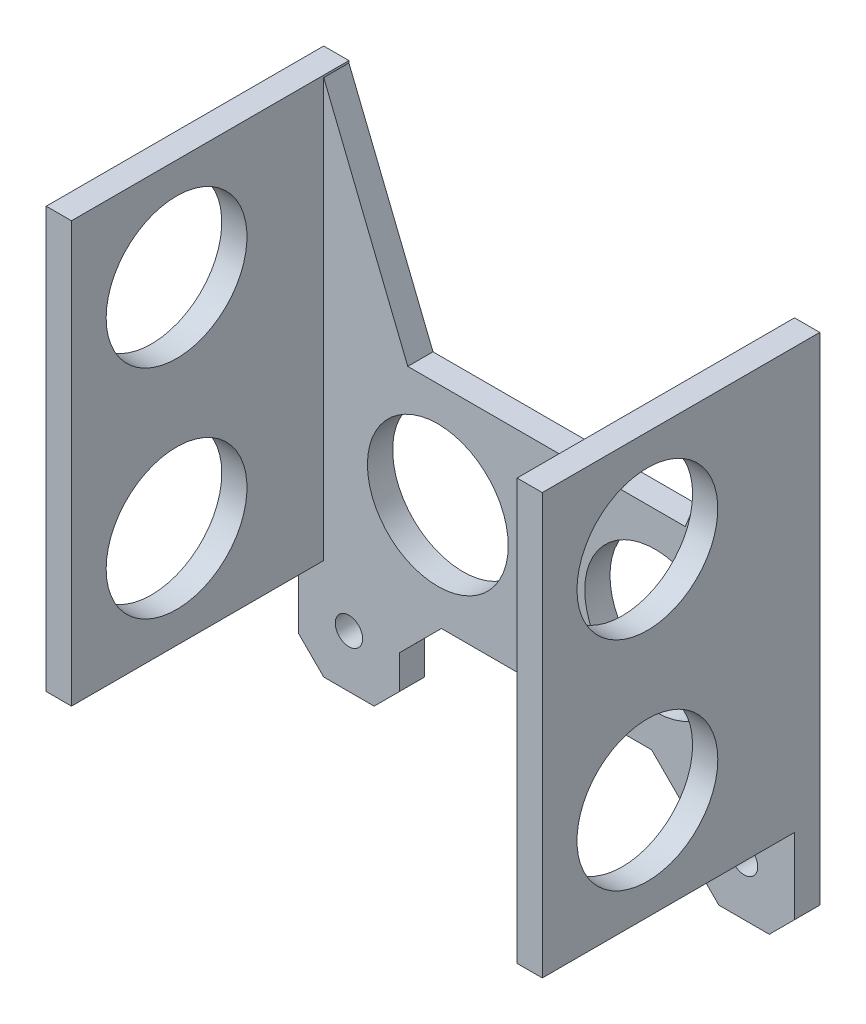
ISO-10303-21;
HEADER;
FILE_DESCRIPTION(('STEP AP214'),'2;1');
FILE_NAME('part.step','',(''),(''),'','','');
FILE_SCHEMA(('AUTOMOTIVE_DESIGN { 1 0 10303 214 1 1 1 1 }'));
ENDSEC;
DATA;
#1=APPLICATION_CONTEXT('core data for automotive mechanical design processes');
#2=APPLICATION_PROTOCOL_DEFINITION('international standard','automotive_design',2000,#1);
#3=PRODUCT_CONTEXT('',#1,'mechanical');
#4=PRODUCT('Part','Part','',(#3));
#5=PRODUCT_RELATED_PRODUCT_CATEGORY('part','',(#4));
#6=PRODUCT_DEFINITION_FORMATION('','',#4);
#7=PRODUCT_DEFINITION_CONTEXT('part definition',#1,'design');
#8=PRODUCT_DEFINITION('design','',#6,#7);
#9=PRODUCT_DEFINITION_SHAPE('','',#8);
#10=(LENGTH_UNIT() NAMED_UNIT(*) SI_UNIT(.MILLI.,.METRE.));
#11=(NAMED_UNIT(*) PLANE_ANGLE_UNIT() SI_UNIT($,.RADIAN.));
#12=(NAMED_UNIT(*) SI_UNIT($,.STERADIAN.) SOLID_ANGLE_UNIT());
#13=UNCERTAINTY_MEASURE_WITH_UNIT(LENGTH_MEASURE(1.E-05),#10,'distance_accuracy_value','');
#14=(GEOMETRIC_REPRESENTATION_CONTEXT(3) GLOBAL_UNCERTAINTY_ASSIGNED_CONTEXT((#13)) GLOBAL_UNIT_ASSIGNED_CONTEXT((#10,
#11,#12)) REPRESENTATION_CONTEXT('',''));
#15=CARTESIAN_POINT('',(0.,0.,0.));
#16=DIRECTION('',(0.,0.,1.));
#17=DIRECTION('',(1.,0.,0.));
#18=AXIS2_PLACEMENT_3D('',#15,#16,#17);
#19=CARTESIAN_POINT('',(0.,0.,0.));
#20=DIRECTION('',(0.,-1.,0.));
#21=DIRECTION('',(0.,0.,-1.));
#22=AXIS2_PLACEMENT_3D('',#19,#20,#21);
#23=PLANE('',#22);
#24=DIRECTION('',(0.,0.,1.));
#25=VECTOR('',#24,1.);
#26=CARTESIAN_POINT('',(26.5,0.,0.));
#27=LINE('',#26,#25);
#28=CARTESIAN_POINT('',(26.5,0.,0.));
#29=VERTEX_POINT('',#28);
#30=CARTESIAN_POINT('',(26.5,0.,30.));
#31=VERTEX_POINT('',#30);
#32=EDGE_CURVE('E499',#29,#31,#27,.T.);
#33=ORIENTED_EDGE('',*,*,#32,.F.);
#34=DIRECTION('',(-1.,0.,0.));
#35=VECTOR('',#34,1.);
#36=CARTESIAN_POINT('',(12.5,0.,0.));
#37=LINE('',#36,#35);
#38=CARTESIAN_POINT('',(29.5,0.,0.));
#39=VERTEX_POINT('',#38);
#40=EDGE_CURVE('E514',#39,#29,#37,.T.);
#41=ORIENTED_EDGE('',*,*,#40,.F.);
#42=DIRECTION('',(0.,0.,-1.));
#43=VECTOR('',#42,1.);
#44=CARTESIAN_POINT('',(29.5,0.,30.));
#45=LINE('',#44,#43);
#46=CARTESIAN_POINT('',(29.5,0.,30.));
#47=VERTEX_POINT('',#46);
#48=EDGE_CURVE('E236',#47,#39,#45,.T.);
#49=ORIENTED_EDGE('',*,*,#48,.F.);
#50=DIRECTION('',(1.,0.,0.));
#51=VECTOR('',#50,1.);
#52=CARTESIAN_POINT('',(26.5,0.,30.));
#53=LINE('',#52,#51);
#54=EDGE_CURVE('E243',#31,#47,#53,.T.);
#55=ORIENTED_EDGE('',*,*,#54,.F.);
#56=EDGE_LOOP('',(#33,#41,#49,#55));
#57=FACE_BOUND('',#56,.T.);
#58=ADVANCED_FACE('F41',(#57),#23,.T.);
#59=DIRECTION('',(-1.,0.,0.));
#60=VECTOR('',#59,1.);
#61=CARTESIAN_POINT('',(-29.5,0.,0.));
#62=LINE('',#61,#60);
#63=CARTESIAN_POINT('',(-26.5,0.,0.));
#64=VERTEX_POINT('',#63);
#65=CARTESIAN_POINT('',(-29.5,0.,0.));
#66=VERTEX_POINT('',#65);
#67=EDGE_CURVE('E323',#64,#66,#62,.T.);
#68=ORIENTED_EDGE('',*,*,#67,.F.);
#69=DIRECTION('',(0.,0.,-1.));
#70=VECTOR('',#69,1.);
#71=CARTESIAN_POINT('',(-26.5,0.,0.));
#72=LINE('',#71,#70);
#73=CARTESIAN_POINT('',(-26.5,0.,30.));
#74=VERTEX_POINT('',#73);
#75=EDGE_CURVE('E249',#74,#64,#72,.T.);
#76=ORIENTED_EDGE('',*,*,#75,.F.);
#77=DIRECTION('',(1.,0.,0.));
#78=VECTOR('',#77,1.);
#79=CARTESIAN_POINT('',(-26.5,0.,30.));
#80=LINE('',#79,#78);
#81=CARTESIAN_POINT('',(-29.5,0.,30.));
#82=VERTEX_POINT('',#81);
#83=EDGE_CURVE('E240',#82,#74,#80,.T.);
#84=ORIENTED_EDGE('',*,*,#83,.F.);
#85=DIRECTION('',(0.,0.,1.));
#86=VECTOR('',#85,1.);
#87=CARTESIAN_POINT('',(-29.5,0.,30.));
#88=LINE('',#87,#86);
#89=EDGE_CURVE('E235',#66,#82,#88,.T.);
#90=ORIENTED_EDGE('',*,*,#89,.F.);
#91=EDGE_LOOP('',(#68,#76,#84,#90));
#92=FACE_BOUND('',#91,.T.);
#93=ADVANCED_FACE('F585',(#92),#23,.T.);
#94=CARTESIAN_POINT('',(0.,25.,0.));
#95=DIRECTION('',(0.,-1.,0.));
#96=DIRECTION('',(0.,0.,-1.));
#97=AXIS2_PLACEMENT_3D('',#94,#95,#96);
#98=PLANE('',#97);
#99=DIRECTION('',(-1.,0.,0.));
#100=VECTOR('',#99,1.);
#101=CARTESIAN_POINT('',(-29.5,25.,-3.));
#102=LINE('',#101,#100);
#103=CARTESIAN_POINT('',(16.5,25.,-3.));
#104=VERTEX_POINT('',#103);
#105=CARTESIAN_POINT('',(-16.5,25.,-3.));
#106=VERTEX_POINT('',#105);
#107=EDGE_CURVE('E259',#104,#106,#102,.T.);
#108=ORIENTED_EDGE('',*,*,#107,.T.);
#109=DIRECTION('',(0.,0.,1.));
#110=VECTOR('',#109,1.);
#111=CARTESIAN_POINT('',(-16.5,25.,0.));
#112=LINE('',#111,#110);
#113=CARTESIAN_POINT('',(-16.5,25.,0.));
#114=VERTEX_POINT('',#113);
#115=EDGE_CURVE('E299',#106,#114,#112,.T.);
#116=ORIENTED_EDGE('',*,*,#115,.T.);
#117=DIRECTION('',(1.,0.,0.));
#118=VECTOR('',#117,1.);
#119=CARTESIAN_POINT('',(-26.5,25.,0.));
#120=LINE('',#119,#118);
#121=CARTESIAN_POINT('',(16.5,25.,0.));
#122=VERTEX_POINT('',#121);
#123=EDGE_CURVE('E253',#114,#122,#120,.T.);
#124=ORIENTED_EDGE('',*,*,#123,.T.);
#125=DIRECTION('',(0.,0.,-1.));
#126=VECTOR('',#125,1.);
#127=CARTESIAN_POINT('',(16.5,25.,-3.));
#128=LINE('',#127,#126);
#129=EDGE_CURVE('E285',#122,#104,#128,.T.);
#130=ORIENTED_EDGE('',*,*,#129,.T.);
#131=EDGE_LOOP('',(#108,#116,#124,#130));
#132=FACE_BOUND('',#131,.T.);
#133=ADVANCED_FACE('F576',(#132),#98,.F.);
#134=CARTESIAN_POINT('',(-26.5,25.,0.));
#135=DIRECTION('',(0.,0.,-1.));
#136=DIRECTION('',(-1.,0.,0.));
#137=AXIS2_PLACEMENT_3D('',#134,#135,#136);
#138=PLANE('',#137);
#139=CARTESIAN_POINT('',(-12.925,12.5,0.));
#140=DIRECTION('',(0.,0.,-1.));
#141=DIRECTION('',(-1.,0.,0.));
#142=AXIS2_PLACEMENT_3D('',#139,#140,#141);
#143=CIRCLE('',#142,8.375);
#144=CARTESIAN_POINT('',(-21.3,12.5,0.));
#145=VERTEX_POINT('',#144);
#146=EDGE_CURVE('E486',#145,#145,#143,.T.);
#147=ORIENTED_EDGE('',*,*,#146,.T.);
#148=EDGE_LOOP('',(#147));
#149=FACE_BOUND('',#148,.T.);
#150=CARTESIAN_POINT('',(12.925,12.5,0.));
#151=DIRECTION('',(0.,0.,-1.));
#152=DIRECTION('',(-1.,0.,0.));
#153=AXIS2_PLACEMENT_3D('',#150,#151,#152);
#154=CIRCLE('',#153,8.375);
#155=CARTESIAN_POINT('',(4.55,12.5,0.));
#156=VERTEX_POINT('',#155);
#157=EDGE_CURVE('E479',#156,#156,#154,.T.);
#158=ORIENTED_EDGE('',*,*,#157,.T.);
#159=EDGE_LOOP('',(#158));
#160=FACE_BOUND('',#159,.T.);
#161=DIRECTION('',(1.,0.,0.));
#162=VECTOR('',#161,1.);
#163=CARTESIAN_POINT('',(29.5,-12.,0.));
#164=LINE('',#163,#162);
#165=CARTESIAN_POINT('',(20.5,-12.,0.));
#166=VERTEX_POINT('',#165);
#167=CARTESIAN_POINT('',(26.5,-12.,0.));
#168=VERTEX_POINT('',#167);
#169=EDGE_CURVE('E531',#166,#168,#164,.T.);
#170=ORIENTED_EDGE('',*,*,#169,.T.);
#171=DIRECTION('',(0.707106781186546,0.707106781186549,0.));
#172=VECTOR('',#171,1.);
#173=CARTESIAN_POINT('',(26.5,-12.,0.));
#174=LINE('',#173,#172);
#175=CARTESIAN_POINT('',(29.5,-8.99999999999995,0.));
#176=VERTEX_POINT('',#175);
#177=EDGE_CURVE('E340',#168,#176,#174,.T.);
#178=ORIENTED_EDGE('',*,*,#177,.T.);
#179=DIRECTION('',(0.,1.,0.));
#180=VECTOR('',#179,1.);
#181=CARTESIAN_POINT('',(29.5,0.,0.));
#182=LINE('',#181,#180);
#183=EDGE_CURVE('E228',#176,#39,#182,.T.);
#184=ORIENTED_EDGE('',*,*,#183,.T.);
#185=ORIENTED_EDGE('',*,*,#40,.T.);
#186=DIRECTION('',(0.,-1.,0.));
#187=VECTOR('',#186,1.);
#188=CARTESIAN_POINT('',(26.5,25.,0.));
#189=LINE('',#188,#187);
#190=CARTESIAN_POINT('',(26.5,49.7508685341634,0.));
#191=VERTEX_POINT('',#190);
#192=EDGE_CURVE('E281',#191,#29,#189,.T.);
#193=ORIENTED_EDGE('',*,*,#192,.F.);
#194=DIRECTION('',(0.374606593415906,0.92718385456679,0.));
#195=VECTOR('',#194,1.);
#196=CARTESIAN_POINT('',(10.4658057072812,10.0648450351317,0.));
#197=LINE('',#196,#195);
#198=EDGE_CURVE('E317',#191,#122,#197,.F.);
#199=ORIENTED_EDGE('',*,*,#198,.T.);
#200=ORIENTED_EDGE('',*,*,#123,.F.);
#201=DIRECTION('',(0.374606593415906,-0.92718385456679,0.));
#202=VECTOR('',#201,1.);
#203=CARTESIAN_POINT('',(-17.9033009983067,28.4732918522949,0.));
#204=LINE('',#203,#202);
#205=CARTESIAN_POINT('',(-26.5,49.7508685341634,0.));
#206=VERTEX_POINT('',#205);
#207=EDGE_CURVE('E310',#114,#206,#204,.F.);
#208=ORIENTED_EDGE('',*,*,#207,.T.);
#209=DIRECTION('',(0.,-1.,0.));
#210=VECTOR('',#209,1.);
#211=CARTESIAN_POINT('',(-26.5,25.,0.));
#212=LINE('',#211,#210);
#213=EDGE_CURVE('E254',#206,#64,#212,.T.);
#214=ORIENTED_EDGE('',*,*,#213,.T.);
#215=ORIENTED_EDGE('',*,*,#67,.T.);
#216=DIRECTION('',(0.,-1.,0.));
#217=VECTOR('',#216,1.);
#218=CARTESIAN_POINT('',(-29.5,0.,0.));
#219=LINE('',#218,#217);
#220=CARTESIAN_POINT('',(-29.5,-9.,0.));
#221=VERTEX_POINT('',#220);
#222=EDGE_CURVE('E394',#66,#221,#219,.T.);
#223=ORIENTED_EDGE('',*,*,#222,.T.);
#224=DIRECTION('',(0.70710678118655,-0.707106781186545,0.));
#225=VECTOR('',#224,1.);
#226=CARTESIAN_POINT('',(-29.5,-9.,0.));
#227=LINE('',#226,#225);
#228=CARTESIAN_POINT('',(-26.5,-12.,0.));
#229=VERTEX_POINT('',#228);
#230=EDGE_CURVE('E331',#221,#229,#227,.T.);
#231=ORIENTED_EDGE('',*,*,#230,.T.);
#232=DIRECTION('',(1.,0.,0.));
#233=VECTOR('',#232,1.);
#234=CARTESIAN_POINT('',(-29.5,-12.,0.));
#235=LINE('',#234,#233);
#236=CARTESIAN_POINT('',(-20.5,-12.,0.));
#237=VERTEX_POINT('',#236);
#238=EDGE_CURVE('E386',#229,#237,#235,.T.);
#239=ORIENTED_EDGE('',*,*,#238,.T.);
#240=DIRECTION('',(-0.707106781186546,-0.707106781186549,0.));
#241=VECTOR('',#240,1.);
#242=CARTESIAN_POINT('',(-20.5,-12.,0.));
#243=LINE('',#242,#241);
#244=CARTESIAN_POINT('',(-17.5,-9.,0.));
#245=VERTEX_POINT('',#244);
#246=EDGE_CURVE('E334',#237,#245,#243,.F.);
#247=ORIENTED_EDGE('',*,*,#246,.T.);
#248=DIRECTION('',(0.,1.,0.));
#249=VECTOR('',#248,1.);
#250=CARTESIAN_POINT('',(-17.5,-12.,0.));
#251=LINE('',#250,#249);
#252=CARTESIAN_POINT('',(-17.5,-5.00198398283703,0.));
#253=VERTEX_POINT('',#252);
#254=EDGE_CURVE('E374',#245,#253,#251,.T.);
#255=ORIENTED_EDGE('',*,*,#254,.T.);
#256=DIRECTION('',(0.706966506334051,0.707247028217034,0.));
#257=VECTOR('',#256,1.);
#258=CARTESIAN_POINT('',(-17.5,-5.00198398283703,0.));
#259=LINE('',#258,#257);
#260=CARTESIAN_POINT('',(-12.5,0.,0.));
#261=VERTEX_POINT('',#260);
#262=EDGE_CURVE('E398',#253,#261,#259,.T.);
#263=ORIENTED_EDGE('',*,*,#262,.T.);
#264=DIRECTION('',(1.,0.,0.));
#265=VECTOR('',#264,1.);
#266=CARTESIAN_POINT('',(-26.5,0.,0.));
#267=LINE('',#266,#265);
#268=CARTESIAN_POINT('',(12.5,0.,0.));
#269=VERTEX_POINT('',#268);
#270=EDGE_CURVE('E490',#261,#269,#267,.T.);
#271=ORIENTED_EDGE('',*,*,#270,.T.);
#272=DIRECTION('',(0.706966506334051,-0.707247028217034,0.));
#273=VECTOR('',#272,1.);
#274=CARTESIAN_POINT('',(17.5,-5.00198398283703,0.));
#275=LINE('',#274,#273);
#276=CARTESIAN_POINT('',(17.5,-5.00198398283703,0.));
#277=VERTEX_POINT('',#276);
#278=EDGE_CURVE('E210',#269,#277,#275,.T.);
#279=ORIENTED_EDGE('',*,*,#278,.T.);
#280=DIRECTION('',(0.,-1.,0.));
#281=VECTOR('',#280,1.);
#282=CARTESIAN_POINT('',(17.5,-12.,0.));
#283=LINE('',#282,#281);
#284=CARTESIAN_POINT('',(17.5,-9.00000000000001,0.));
#285=VERTEX_POINT('',#284);
#286=EDGE_CURVE('E520',#277,#285,#283,.T.);
#287=ORIENTED_EDGE('',*,*,#286,.T.);
#288=DIRECTION('',(-0.707106781186549,0.707106781186546,0.));
#289=VECTOR('',#288,1.);
#290=CARTESIAN_POINT('',(17.5,-9.00000000000001,0.));
#291=LINE('',#290,#289);
#292=EDGE_CURVE('E337',#285,#166,#291,.F.);
#293=ORIENTED_EDGE('',*,*,#292,.T.);
#294=EDGE_LOOP('',(#170,#178,#184,#185,#193,#199,#200,#208,#214,#215,#223,#231,#239,#247,#255,
#263,#271,#279,#287,#293));
#295=FACE_BOUND('',#294,.T.);
#296=CARTESIAN_POINT('',(-23.5,-5.75,0.));
#297=DIRECTION('',(0.,0.,1.));
#298=DIRECTION('',(1.,0.,0.));
#299=AXIS2_PLACEMENT_3D('',#296,#297,#298);
#300=CIRCLE('',#299,1.625);
#301=CARTESIAN_POINT('',(-21.875,-5.75,0.));
#302=VERTEX_POINT('',#301);
#303=EDGE_CURVE('E537',#302,#302,#300,.T.);
#304=ORIENTED_EDGE('',*,*,#303,.F.);
#305=EDGE_LOOP('',(#304));
#306=FACE_BOUND('',#305,.T.);
#307=CARTESIAN_POINT('',(23.5,-5.74999999999999,0.));
#308=DIRECTION('',(0.,0.,1.));
#309=DIRECTION('',(-1.,0.,0.));
#310=AXIS2_PLACEMENT_3D('',#307,#308,#309);
#311=CIRCLE('',#310,1.625);
#312=CARTESIAN_POINT('',(21.875,-5.74999999999999,0.));
#313=VERTEX_POINT('',#312);
#314=EDGE_CURVE('E523',#313,#313,#311,.T.);
#315=ORIENTED_EDGE('',*,*,#314,.F.);
#316=EDGE_LOOP('',(#315));
#317=FACE_BOUND('',#316,.T.);
#318=ADVANCED_FACE('F390',(#149,#160,#295,#306,#317),#138,.F.);
#319=CARTESIAN_POINT('',(26.5,25.,0.));
#320=DIRECTION('',(1.,0.,0.));
#321=DIRECTION('',(0.,0.,-1.));
#322=AXIS2_PLACEMENT_3D('',#319,#320,#321);
#323=PLANE('',#322);
#324=CARTESIAN_POINT('',(26.5,37.925,17.5));
#325=DIRECTION('',(1.,0.,0.));
#326=DIRECTION('',(0.,0.,-1.));
#327=AXIS2_PLACEMENT_3D('',#324,#325,#326);
#328=CIRCLE('',#327,8.375);
#329=CARTESIAN_POINT('',(26.5,37.925,9.125));
#330=VERTEX_POINT('',#329);
#331=EDGE_CURVE('E296',#330,#330,#328,.T.);
#332=ORIENTED_EDGE('',*,*,#331,.T.);
#333=EDGE_LOOP('',(#332));
#334=FACE_BOUND('',#333,.T.);
#335=CARTESIAN_POINT('',(26.5,12.075,17.5));
#336=DIRECTION('',(1.,0.,0.));
#337=DIRECTION('',(0.,0.,-1.));
#338=AXIS2_PLACEMENT_3D('',#335,#336,#337);
#339=CIRCLE('',#338,8.375);
#340=CARTESIAN_POINT('',(26.5,12.075,9.125));
#341=VERTEX_POINT('',#340);
#342=EDGE_CURVE('E290',#341,#341,#339,.T.);
#343=ORIENTED_EDGE('',*,*,#342,.T.);
#344=EDGE_LOOP('',(#343));
#345=FACE_BOUND('',#344,.T.);
#346=DIRECTION('',(0.,-1.,0.));
#347=VECTOR('',#346,1.);
#348=CARTESIAN_POINT('',(26.5,25.,-3.));
#349=LINE('',#348,#347);
#350=CARTESIAN_POINT('',(26.5,50.,-3.));
#351=VERTEX_POINT('',#350);
#352=CARTESIAN_POINT('',(26.5,49.7508685341634,-3.));
#353=VERTEX_POINT('',#352);
#354=EDGE_CURVE('E461',#351,#353,#349,.T.);
#355=ORIENTED_EDGE('',*,*,#354,.T.);
#356=DIRECTION('',(0.,0.,1.));
#357=VECTOR('',#356,1.);
#358=CARTESIAN_POINT('',(26.5,49.7508685341634,0.));
#359=LINE('',#358,#357);
#360=EDGE_CURVE('E306',#353,#191,#359,.T.);
#361=ORIENTED_EDGE('',*,*,#360,.T.);
#362=ORIENTED_EDGE('',*,*,#192,.T.);
#363=ORIENTED_EDGE('',*,*,#32,.T.);
#364=DIRECTION('',(0.,-1.,0.));
#365=VECTOR('',#364,1.);
#366=CARTESIAN_POINT('',(26.5,25.,30.));
#367=LINE('',#366,#365);
#368=CARTESIAN_POINT('',(26.5,50.,30.));
#369=VERTEX_POINT('',#368);
#370=EDGE_CURVE('E277',#369,#31,#367,.T.);
#371=ORIENTED_EDGE('',*,*,#370,.F.);
#372=DIRECTION('',(0.,0.,-1.));
#373=VECTOR('',#372,1.);
#374=CARTESIAN_POINT('',(26.5,50.,-3.));
#375=LINE('',#374,#373);
#376=EDGE_CURVE('E452',#369,#351,#375,.T.);
#377=ORIENTED_EDGE('',*,*,#376,.T.);
#378=EDGE_LOOP('',(#355,#361,#362,#363,#371,#377));
#379=FACE_BOUND('',#378,.T.);
#380=ADVANCED_FACE('F575',(#334,#345,#379),#323,.F.);
#381=CARTESIAN_POINT('',(26.5,25.,30.));
#382=DIRECTION('',(0.,0.,-1.));
#383=DIRECTION('',(-1.,0.,0.));
#384=AXIS2_PLACEMENT_3D('',#381,#382,#383);
#385=PLANE('',#384);
#386=ORIENTED_EDGE('',*,*,#54,.T.);
#387=DIRECTION('',(0.,-1.,0.));
#388=VECTOR('',#387,1.);
#389=CARTESIAN_POINT('',(29.5,25.,30.));
#390=LINE('',#389,#388);
#391=CARTESIAN_POINT('',(29.5,50.,30.));
#392=VERTEX_POINT('',#391);
#393=EDGE_CURVE('E273',#392,#47,#390,.T.);
#394=ORIENTED_EDGE('',*,*,#393,.F.);
#395=DIRECTION('',(-1.,0.,0.));
#396=VECTOR('',#395,1.);
#397=CARTESIAN_POINT('',(29.5,50.,30.));
#398=LINE('',#397,#396);
#399=EDGE_CURVE('E460',#392,#369,#398,.T.);
#400=ORIENTED_EDGE('',*,*,#399,.T.);
#401=ORIENTED_EDGE('',*,*,#370,.T.);
#402=EDGE_LOOP('',(#386,#394,#400,#401));
#403=FACE_BOUND('',#402,.T.);
#404=ADVANCED_FACE('F504',(#403),#385,.F.);
#405=CARTESIAN_POINT('',(29.5,25.,30.));
#406=DIRECTION('',(-1.,0.,0.));
#407=DIRECTION('',(0.,0.,1.));
#408=AXIS2_PLACEMENT_3D('',#405,#406,#407);
#409=PLANE('',#408);
#410=CARTESIAN_POINT('',(29.5,37.925,17.5));
#411=DIRECTION('',(-1.,0.,0.));
#412=DIRECTION('',(0.,0.,1.));
#413=AXIS2_PLACEMENT_3D('',#410,#411,#412);
#414=CIRCLE('',#413,8.375);
#415=CARTESIAN_POINT('',(29.5,37.925,25.875));
#416=VERTEX_POINT('',#415);
#417=EDGE_CURVE('E291',#416,#416,#414,.T.);
#418=ORIENTED_EDGE('',*,*,#417,.T.);
#419=EDGE_LOOP('',(#418));
#420=FACE_BOUND('',#419,.T.);
#421=CARTESIAN_POINT('',(29.5,12.075,17.5));
#422=DIRECTION('',(-1.,0.,0.));
#423=DIRECTION('',(0.,0.,-1.));
#424=AXIS2_PLACEMENT_3D('',#421,#422,#423);
#425=CIRCLE('',#424,8.375);
#426=CARTESIAN_POINT('',(29.5,12.075,9.125));
#427=VERTEX_POINT('',#426);
#428=EDGE_CURVE('E423',#427,#427,#425,.T.);
#429=ORIENTED_EDGE('',*,*,#428,.T.);
#430=EDGE_LOOP('',(#429));
#431=FACE_BOUND('',#430,.T.);
#432=ORIENTED_EDGE('',*,*,#183,.F.);
#433=DIRECTION('',(0.,0.,-1.));
#434=VECTOR('',#433,1.);
#435=CARTESIAN_POINT('',(29.5,-8.99999999999995,-3.));
#436=LINE('',#435,#434);
#437=CARTESIAN_POINT('',(29.5,-8.99999999999995,-3.));
#438=VERTEX_POINT('',#437);
#439=EDGE_CURVE('E343',#176,#438,#436,.T.);
#440=ORIENTED_EDGE('',*,*,#439,.T.);
#441=DIRECTION('',(0.,-1.,0.));
#442=VECTOR('',#441,1.);
#443=CARTESIAN_POINT('',(29.5,25.,-3.));
#444=LINE('',#443,#442);
#445=CARTESIAN_POINT('',(29.5,50.,-3.));
#446=VERTEX_POINT('',#445);
#447=EDGE_CURVE('E270',#446,#438,#444,.T.);
#448=ORIENTED_EDGE('',*,*,#447,.F.);
#449=DIRECTION('',(0.,0.,-1.));
#450=VECTOR('',#449,1.);
#451=CARTESIAN_POINT('',(29.5,50.,0.));
#452=LINE('',#451,#450);
#453=EDGE_CURVE('E456',#392,#446,#452,.T.);
#454=ORIENTED_EDGE('',*,*,#453,.F.);
#455=ORIENTED_EDGE('',*,*,#393,.T.);
#456=ORIENTED_EDGE('',*,*,#48,.T.);
#457=EDGE_LOOP('',(#432,#440,#448,#454,#455,#456));
#458=FACE_BOUND('',#457,.T.);
#459=ADVANCED_FACE('F512',(#420,#431,#458),#409,.F.);
#460=CARTESIAN_POINT('',(-29.5,25.,-3.));
#461=DIRECTION('',(0.,0.,1.));
#462=DIRECTION('',(1.,0.,0.));
#463=AXIS2_PLACEMENT_3D('',#460,#461,#462);
#464=PLANE('',#463);
#465=CARTESIAN_POINT('',(-12.925,12.5,-3.));
#466=DIRECTION('',(0.,0.,1.));
#467=DIRECTION('',(1.,0.,0.));
#468=AXIS2_PLACEMENT_3D('',#465,#466,#467);
#469=CIRCLE('',#468,8.375);
#470=CARTESIAN_POINT('',(-4.55,12.5,-3.));
#471=VERTEX_POINT('',#470);
#472=EDGE_CURVE('E475',#471,#471,#469,.T.);
#473=ORIENTED_EDGE('',*,*,#472,.T.);
#474=EDGE_LOOP('',(#473));
#475=FACE_BOUND('',#474,.T.);
#476=CARTESIAN_POINT('',(12.925,12.5,-3.));
#477=DIRECTION('',(0.,0.,1.));
#478=DIRECTION('',(-1.,0.,0.));
#479=AXIS2_PLACEMENT_3D('',#476,#477,#478);
#480=CIRCLE('',#479,8.375);
#481=CARTESIAN_POINT('',(4.55,12.5,-3.));
#482=VERTEX_POINT('',#481);
#483=EDGE_CURVE('E471',#482,#482,#480,.T.);
#484=ORIENTED_EDGE('',*,*,#483,.T.);
#485=EDGE_LOOP('',(#484));
#486=FACE_BOUND('',#485,.T.);
#487=ORIENTED_EDGE('',*,*,#447,.T.);
#488=DIRECTION('',(-0.707106781186546,-0.707106781186549,0.));
#489=VECTOR('',#488,1.);
#490=CARTESIAN_POINT('',(26.5,-12.,-3.));
#491=LINE('',#490,#489);
#492=CARTESIAN_POINT('',(26.5,-12.,-3.));
#493=VERTEX_POINT('',#492);
#494=EDGE_CURVE('E353',#438,#493,#491,.T.);
#495=ORIENTED_EDGE('',*,*,#494,.T.);
#496=DIRECTION('',(1.,0.,0.));
#497=VECTOR('',#496,1.);
#498=CARTESIAN_POINT('',(29.5,-12.,-3.));
#499=LINE('',#498,#497);
#500=CARTESIAN_POINT('',(20.5,-12.,-3.));
#501=VERTEX_POINT('',#500);
#502=EDGE_CURVE('E216',#501,#493,#499,.T.);
#503=ORIENTED_EDGE('',*,*,#502,.F.);
#504=DIRECTION('',(0.707106781186549,-0.707106781186546,0.));
#505=VECTOR('',#504,1.);
#506=CARTESIAN_POINT('',(17.5,-9.00000000000001,-3.));
#507=LINE('',#506,#505);
#508=CARTESIAN_POINT('',(17.5,-9.00000000000001,-3.));
#509=VERTEX_POINT('',#508);
#510=EDGE_CURVE('E350',#501,#509,#507,.F.);
#511=ORIENTED_EDGE('',*,*,#510,.T.);
#512=DIRECTION('',(0.,-1.,0.));
#513=VECTOR('',#512,1.);
#514=CARTESIAN_POINT('',(17.5,-12.,-3.));
#515=LINE('',#514,#513);
#516=CARTESIAN_POINT('',(17.5,-5.00198398283703,-3.));
#517=VERTEX_POINT('',#516);
#518=EDGE_CURVE('E226',#517,#509,#515,.T.);
#519=ORIENTED_EDGE('',*,*,#518,.F.);
#520=DIRECTION('',(0.706966506334051,-0.707247028217034,0.));
#521=VECTOR('',#520,1.);
#522=CARTESIAN_POINT('',(17.5,-5.00198398283703,-3.));
#523=LINE('',#522,#521);
#524=CARTESIAN_POINT('',(12.5,0.,-3.));
#525=VERTEX_POINT('',#524);
#526=EDGE_CURVE('E208',#525,#517,#523,.T.);
#527=ORIENTED_EDGE('',*,*,#526,.F.);
#528=DIRECTION('',(-1.,0.,0.));
#529=VECTOR('',#528,1.);
#530=CARTESIAN_POINT('',(-29.5,0.,-3.));
#531=LINE('',#530,#529);
#532=CARTESIAN_POINT('',(-12.5,0.,-3.));
#533=VERTEX_POINT('',#532);
#534=EDGE_CURVE('E223',#525,#533,#531,.T.);
#535=ORIENTED_EDGE('',*,*,#534,.T.);
#536=DIRECTION('',(0.706966506334051,0.707247028217034,0.));
#537=VECTOR('',#536,1.);
#538=CARTESIAN_POINT('',(-17.5,-5.00198398283703,-3.));
#539=LINE('',#538,#537);
#540=CARTESIAN_POINT('',(-17.5,-5.00198398283703,-3.));
#541=VERTEX_POINT('',#540);
#542=EDGE_CURVE('E376',#541,#533,#539,.T.);
#543=ORIENTED_EDGE('',*,*,#542,.F.);
#544=DIRECTION('',(0.,1.,0.));
#545=VECTOR('',#544,1.);
#546=CARTESIAN_POINT('',(-17.5,-12.,-3.));
#547=LINE('',#546,#545);
#548=CARTESIAN_POINT('',(-17.5,-9.,-3.));
#549=VERTEX_POINT('',#548);
#550=EDGE_CURVE('E372',#549,#541,#547,.T.);
#551=ORIENTED_EDGE('',*,*,#550,.F.);
#552=DIRECTION('',(0.707106781186546,0.707106781186549,0.));
#553=VECTOR('',#552,1.);
#554=CARTESIAN_POINT('',(-20.5,-12.,-3.));
#555=LINE('',#554,#553);
#556=CARTESIAN_POINT('',(-20.5,-12.,-3.));
#557=VERTEX_POINT('',#556);
#558=EDGE_CURVE('E64',#549,#557,#555,.F.);
#559=ORIENTED_EDGE('',*,*,#558,.T.);
#560=DIRECTION('',(1.,0.,0.));
#561=VECTOR('',#560,1.);
#562=CARTESIAN_POINT('',(-29.5,-12.,-3.));
#563=LINE('',#562,#561);
#564=CARTESIAN_POINT('',(-26.5,-12.,-3.));
#565=VERTEX_POINT('',#564);
#566=EDGE_CURVE('E378',#565,#557,#563,.T.);
#567=ORIENTED_EDGE('',*,*,#566,.F.);
#568=DIRECTION('',(-0.70710678118655,0.707106781186545,0.));
#569=VECTOR('',#568,1.);
#570=CARTESIAN_POINT('',(-29.5,-9.,-3.));
#571=LINE('',#570,#569);
#572=CARTESIAN_POINT('',(-29.5,-9.,-3.));
#573=VERTEX_POINT('',#572);
#574=EDGE_CURVE('E58',#565,#573,#571,.T.);
#575=ORIENTED_EDGE('',*,*,#574,.T.);
#576=DIRECTION('',(0.,-1.,0.));
#577=VECTOR('',#576,1.);
#578=CARTESIAN_POINT('',(-29.5,25.,-3.));
#579=LINE('',#578,#577);
#580=CARTESIAN_POINT('',(-29.5,50.,-2.99999999999999));
#581=VERTEX_POINT('',#580);
#582=EDGE_CURVE('E267',#581,#573,#579,.T.);
#583=ORIENTED_EDGE('',*,*,#582,.F.);
#584=DIRECTION('',(-1.,0.,0.));
#585=VECTOR('',#584,1.);
#586=CARTESIAN_POINT('',(-26.5,50.,-2.99999999999999));
#587=LINE('',#586,#585);
#588=CARTESIAN_POINT('',(-26.5,50.,-2.99999999999999));
#589=VERTEX_POINT('',#588);
#590=EDGE_CURVE('E448',#589,#581,#587,.T.);
#591=ORIENTED_EDGE('',*,*,#590,.F.);
#592=DIRECTION('',(0.,-1.,0.));
#593=VECTOR('',#592,1.);
#594=CARTESIAN_POINT('',(-26.5,50.,-2.99999999999999));
#595=LINE('',#594,#593);
#596=CARTESIAN_POINT('',(-26.5,49.7508685341634,-2.99999999999999));
#597=VERTEX_POINT('',#596);
#598=EDGE_CURVE('E440',#589,#597,#595,.T.);
#599=ORIENTED_EDGE('',*,*,#598,.T.);
#600=DIRECTION('',(-0.374606593415906,0.92718385456679,0.));
#601=VECTOR('',#600,1.);
#602=CARTESIAN_POINT('',(-18.3242912977987,29.5152794079834,-3.));
#603=LINE('',#602,#601);
#604=EDGE_CURVE('E314',#597,#106,#603,.F.);
#605=ORIENTED_EDGE('',*,*,#604,.T.);
#606=ORIENTED_EDGE('',*,*,#107,.F.);
#607=DIRECTION('',(-0.374606593415906,-0.92718385456679,0.));
#608=VECTOR('',#607,1.);
#609=CARTESIAN_POINT('',(10.0448154077892,9.02285747944326,-3.));
#610=LINE('',#609,#608);
#611=EDGE_CURVE('E320',#104,#353,#610,.F.);
#612=ORIENTED_EDGE('',*,*,#611,.T.);
#613=ORIENTED_EDGE('',*,*,#354,.F.);
#614=DIRECTION('',(-1.,0.,0.));
#615=VECTOR('',#614,1.);
#616=CARTESIAN_POINT('',(29.5,50.,-3.));
#617=LINE('',#616,#615);
#618=EDGE_CURVE('E468',#446,#351,#617,.T.);
#619=ORIENTED_EDGE('',*,*,#618,.F.);
#620=EDGE_LOOP('',(#487,#495,#503,#511,#519,#527,#535,#543,#551,#559,#567,#575,#583,#591,#599,
#605,#606,#612,#613,#619));
#621=FACE_BOUND('',#620,.T.);
#622=CARTESIAN_POINT('',(-23.5,-5.75,-3.));
#623=DIRECTION('',(0.,0.,1.));
#624=DIRECTION('',(1.,0.,0.));
#625=AXIS2_PLACEMENT_3D('',#622,#623,#624);
#626=CIRCLE('',#625,1.625);
#627=CARTESIAN_POINT('',(-21.875,-5.75,-3.));
#628=VERTEX_POINT('',#627);
#629=EDGE_CURVE('E400',#628,#628,#626,.T.);
#630=ORIENTED_EDGE('',*,*,#629,.T.);
#631=EDGE_LOOP('',(#630));
#632=FACE_BOUND('',#631,.T.);
#633=CARTESIAN_POINT('',(23.5,-5.74999999999999,-3.));
#634=DIRECTION('',(0.,0.,1.));
#635=DIRECTION('',(-1.,0.,0.));
#636=AXIS2_PLACEMENT_3D('',#633,#634,#635);
#637=CIRCLE('',#636,1.625);
#638=CARTESIAN_POINT('',(21.875,-5.74999999999999,-3.));
#639=VERTEX_POINT('',#638);
#640=EDGE_CURVE('E516',#639,#639,#637,.T.);
#641=ORIENTED_EDGE('',*,*,#640,.T.);
#642=EDGE_LOOP('',(#641));
#643=FACE_BOUND('',#642,.T.);
#644=ADVANCED_FACE('F220',(#475,#486,#621,#632,#643),#464,.F.);
#645=CARTESIAN_POINT('',(-29.5,25.,30.));
#646=DIRECTION('',(1.,0.,0.));
#647=DIRECTION('',(0.,0.,-1.));
#648=AXIS2_PLACEMENT_3D('',#645,#646,#647);
#649=PLANE('',#648);
#650=CARTESIAN_POINT('',(-29.5,37.925,17.5));
#651=DIRECTION('',(-1.,0.,0.));
#652=DIRECTION('',(0.,0.,1.));
#653=AXIS2_PLACEMENT_3D('',#650,#651,#652);
#654=CIRCLE('',#653,8.375);
#655=CARTESIAN_POINT('',(-29.5,37.925,25.875));
#656=VERTEX_POINT('',#655);
#657=EDGE_CURVE('E419',#656,#656,#654,.T.);
#658=ORIENTED_EDGE('',*,*,#657,.F.);
#659=EDGE_LOOP('',(#658));
#660=FACE_BOUND('',#659,.T.);
#661=CARTESIAN_POINT('',(-29.5,12.075,17.5));
#662=DIRECTION('',(-1.,0.,0.));
#663=DIRECTION('',(0.,0.,-1.));
#664=AXIS2_PLACEMENT_3D('',#661,#662,#663);
#665=CIRCLE('',#664,8.375);
#666=CARTESIAN_POINT('',(-29.5,12.075,9.125));
#667=VERTEX_POINT('',#666);
#668=EDGE_CURVE('E412',#667,#667,#665,.T.);
#669=ORIENTED_EDGE('',*,*,#668,.F.);
#670=EDGE_LOOP('',(#669));
#671=FACE_BOUND('',#670,.T.);
#672=ORIENTED_EDGE('',*,*,#582,.T.);
#673=DIRECTION('',(0.,0.,1.));
#674=VECTOR('',#673,1.);
#675=CARTESIAN_POINT('',(-29.5,-9.,0.));
#676=LINE('',#675,#674);
#677=EDGE_CURVE('E11',#573,#221,#676,.T.);
#678=ORIENTED_EDGE('',*,*,#677,.T.);
#679=ORIENTED_EDGE('',*,*,#222,.F.);
#680=ORIENTED_EDGE('',*,*,#89,.T.);
#681=DIRECTION('',(0.,-1.,0.));
#682=VECTOR('',#681,1.);
#683=CARTESIAN_POINT('',(-29.5,25.,30.));
#684=LINE('',#683,#682);
#685=CARTESIAN_POINT('',(-29.5,50.,30.));
#686=VERTEX_POINT('',#685);
#687=EDGE_CURVE('E263',#686,#82,#684,.T.);
#688=ORIENTED_EDGE('',*,*,#687,.F.);
#689=DIRECTION('',(0.,0.,-1.));
#690=VECTOR('',#689,1.);
#691=CARTESIAN_POINT('',(-29.5,50.,0.));
#692=LINE('',#691,#690);
#693=EDGE_CURVE('E436',#686,#581,#692,.T.);
#694=ORIENTED_EDGE('',*,*,#693,.T.);
#695=EDGE_LOOP('',(#672,#678,#679,#680,#688,#694));
#696=FACE_BOUND('',#695,.T.);
#697=ADVANCED_FACE('F612',(#660,#671,#696),#649,.F.);
#698=CARTESIAN_POINT('',(-26.5,25.,30.));
#699=DIRECTION('',(0.,0.,-1.));
#700=DIRECTION('',(-1.,0.,0.));
#701=AXIS2_PLACEMENT_3D('',#698,#699,#700);
#702=PLANE('',#701);
#703=ORIENTED_EDGE('',*,*,#83,.T.);
#704=DIRECTION('',(0.,-1.,0.));
#705=VECTOR('',#704,1.);
#706=CARTESIAN_POINT('',(-26.5,25.,30.));
#707=LINE('',#706,#705);
#708=CARTESIAN_POINT('',(-26.5,50.,30.));
#709=VERTEX_POINT('',#708);
#710=EDGE_CURVE('E258',#709,#74,#707,.T.);
#711=ORIENTED_EDGE('',*,*,#710,.F.);
#712=DIRECTION('',(-1.,0.,0.));
#713=VECTOR('',#712,1.);
#714=CARTESIAN_POINT('',(-26.5,50.,30.));
#715=LINE('',#714,#713);
#716=EDGE_CURVE('E444',#709,#686,#715,.T.);
#717=ORIENTED_EDGE('',*,*,#716,.T.);
#718=ORIENTED_EDGE('',*,*,#687,.T.);
#719=EDGE_LOOP('',(#703,#711,#717,#718));
#720=FACE_BOUND('',#719,.T.);
#721=ADVANCED_FACE('F607',(#720),#702,.F.);
#722=CARTESIAN_POINT('',(-26.5,25.,0.));
#723=DIRECTION('',(-1.,0.,0.));
#724=DIRECTION('',(0.,0.,1.));
#725=AXIS2_PLACEMENT_3D('',#722,#723,#724);
#726=PLANE('',#725);
#727=CARTESIAN_POINT('',(-26.5,37.925,17.5));
#728=DIRECTION('',(-1.,0.,0.));
#729=DIRECTION('',(0.,0.,1.));
#730=AXIS2_PLACEMENT_3D('',#727,#728,#729);
#731=CIRCLE('',#730,8.375);
#732=CARTESIAN_POINT('',(-26.5,37.925,25.875));
#733=VERTEX_POINT('',#732);
#734=EDGE_CURVE('E292',#733,#733,#731,.T.);
#735=ORIENTED_EDGE('',*,*,#734,.T.);
#736=EDGE_LOOP('',(#735));
#737=FACE_BOUND('',#736,.T.);
#738=CARTESIAN_POINT('',(-26.5,12.075,17.5));
#739=DIRECTION('',(-1.,0.,0.));
#740=DIRECTION('',(0.,0.,1.));
#741=AXIS2_PLACEMENT_3D('',#738,#739,#740);
#742=CIRCLE('',#741,8.375);
#743=CARTESIAN_POINT('',(-26.5,12.075,25.875));
#744=VERTEX_POINT('',#743);
#745=EDGE_CURVE('E286',#744,#744,#742,.T.);
#746=ORIENTED_EDGE('',*,*,#745,.T.);
#747=EDGE_LOOP('',(#746));
#748=FACE_BOUND('',#747,.T.);
#749=ORIENTED_EDGE('',*,*,#213,.F.);
#750=DIRECTION('',(0.,0.,-1.));
#751=VECTOR('',#750,1.);
#752=CARTESIAN_POINT('',(-26.5,49.7508685341634,-3.));
#753=LINE('',#752,#751);
#754=EDGE_CURVE('E303',#206,#597,#753,.T.);
#755=ORIENTED_EDGE('',*,*,#754,.T.);
#756=ORIENTED_EDGE('',*,*,#598,.F.);
#757=DIRECTION('',(0.,0.,-1.));
#758=VECTOR('',#757,1.);
#759=CARTESIAN_POINT('',(-26.5,50.,0.));
#760=LINE('',#759,#758);
#761=EDGE_CURVE('E437',#709,#589,#760,.T.);
#762=ORIENTED_EDGE('',*,*,#761,.F.);
#763=ORIENTED_EDGE('',*,*,#710,.T.);
#764=ORIENTED_EDGE('',*,*,#75,.T.);
#765=EDGE_LOOP('',(#749,#755,#756,#762,#763,#764));
#766=FACE_BOUND('',#765,.T.);
#767=ADVANCED_FACE('F599',(#737,#748,#766),#726,.F.);
#768=DIRECTION('',(0.,0.,1.));
#769=VECTOR('',#768,1.);
#770=CARTESIAN_POINT('',(12.5,0.,-3.));
#771=LINE('',#770,#769);
#772=EDGE_CURVE('E205',#525,#269,#771,.T.);
#773=ORIENTED_EDGE('',*,*,#772,.T.);
#774=ORIENTED_EDGE('',*,*,#270,.F.);
#775=DIRECTION('',(0.,0.,1.));
#776=VECTOR('',#775,1.);
#777=CARTESIAN_POINT('',(-12.5,0.,-3.));
#778=LINE('',#777,#776);
#779=EDGE_CURVE('E232',#533,#261,#778,.T.);
#780=ORIENTED_EDGE('',*,*,#779,.F.);
#781=ORIENTED_EDGE('',*,*,#534,.F.);
#782=EDGE_LOOP('',(#773,#774,#780,#781));
#783=FACE_BOUND('',#782,.T.);
#784=ADVANCED_FACE('F230',(#783),#23,.T.);
#785=CARTESIAN_POINT('',(12.925,12.5,-3.));
#786=DIRECTION('',(0.,0.,1.));
#787=DIRECTION('',(1.,0.,0.));
#788=AXIS2_PLACEMENT_3D('',#785,#786,#787);
#789=CYLINDRICAL_SURFACE('',#788,8.375);
#790=ORIENTED_EDGE('',*,*,#483,.F.);
#791=EDGE_LOOP('',(#790));
#792=FACE_BOUND('',#791,.T.);
#793=ORIENTED_EDGE('',*,*,#157,.F.);
#794=EDGE_LOOP('',(#793));
#795=FACE_BOUND('',#794,.T.);
#796=ADVANCED_FACE('F598',(#792,#795),#789,.F.);
#797=CARTESIAN_POINT('',(-12.925,12.5,-3.));
#798=DIRECTION('',(0.,0.,1.));
#799=DIRECTION('',(1.,0.,0.));
#800=AXIS2_PLACEMENT_3D('',#797,#798,#799);
#801=CYLINDRICAL_SURFACE('',#800,8.375);
#802=ORIENTED_EDGE('',*,*,#472,.F.);
#803=EDGE_LOOP('',(#802));
#804=FACE_BOUND('',#803,.T.);
#805=ORIENTED_EDGE('',*,*,#146,.F.);
#806=EDGE_LOOP('',(#805));
#807=FACE_BOUND('',#806,.T.);
#808=ADVANCED_FACE('F604',(#804,#807),#801,.F.);
#809=CARTESIAN_POINT('',(29.5,50.,-3.));
#810=DIRECTION('',(0.,1.,0.));
#811=DIRECTION('',(0.,0.,1.));
#812=AXIS2_PLACEMENT_3D('',#809,#810,#811);
#813=PLANE('',#812);
#814=ORIENTED_EDGE('',*,*,#376,.F.);
#815=ORIENTED_EDGE('',*,*,#399,.F.);
#816=ORIENTED_EDGE('',*,*,#453,.T.);
#817=ORIENTED_EDGE('',*,*,#618,.T.);
#818=EDGE_LOOP('',(#814,#815,#816,#817));
#819=FACE_BOUND('',#818,.T.);
#820=ADVANCED_FACE('F658',(#819),#813,.T.);
#821=CARTESIAN_POINT('',(-26.5,50.,0.));
#822=DIRECTION('',(0.,1.,0.));
#823=DIRECTION('',(0.,0.,1.));
#824=AXIS2_PLACEMENT_3D('',#821,#822,#823);
#825=PLANE('',#824);
#826=ORIENTED_EDGE('',*,*,#693,.F.);
#827=ORIENTED_EDGE('',*,*,#716,.F.);
#828=ORIENTED_EDGE('',*,*,#761,.T.);
#829=ORIENTED_EDGE('',*,*,#590,.T.);
#830=EDGE_LOOP('',(#826,#827,#828,#829));
#831=FACE_BOUND('',#830,.T.);
#832=ADVANCED_FACE('F662',(#831),#825,.T.);
#833=CARTESIAN_POINT('',(29.5,12.075,17.5));
#834=DIRECTION('',(-1.,0.,0.));
#835=DIRECTION('',(0.,0.,1.));
#836=AXIS2_PLACEMENT_3D('',#833,#834,#835);
#837=CYLINDRICAL_SURFACE('',#836,8.375);
#838=ORIENTED_EDGE('',*,*,#668,.T.);
#839=EDGE_LOOP('',(#838));
#840=FACE_BOUND('',#839,.T.);
#841=ORIENTED_EDGE('',*,*,#745,.F.);
#842=EDGE_LOOP('',(#841));
#843=FACE_BOUND('',#842,.T.);
#844=ADVANCED_FACE('F667',(#840,#843),#837,.F.);
#845=CARTESIAN_POINT('',(29.5,37.925,17.5));
#846=DIRECTION('',(-1.,0.,0.));
#847=DIRECTION('',(0.,0.,1.));
#848=AXIS2_PLACEMENT_3D('',#845,#846,#847);
#849=CYLINDRICAL_SURFACE('',#848,8.375);
#850=ORIENTED_EDGE('',*,*,#657,.T.);
#851=EDGE_LOOP('',(#850));
#852=FACE_BOUND('',#851,.T.);
#853=ORIENTED_EDGE('',*,*,#734,.F.);
#854=EDGE_LOOP('',(#853));
#855=FACE_BOUND('',#854,.T.);
#856=ADVANCED_FACE('F678',(#852,#855),#849,.F.);
#857=ORIENTED_EDGE('',*,*,#428,.F.);
#858=EDGE_LOOP('',(#857));
#859=FACE_BOUND('',#858,.T.);
#860=ORIENTED_EDGE('',*,*,#342,.F.);
#861=EDGE_LOOP('',(#860));
#862=FACE_BOUND('',#861,.T.);
#863=ADVANCED_FACE('F681',(#859,#862),#837,.F.);
#864=ORIENTED_EDGE('',*,*,#417,.F.);
#865=EDGE_LOOP('',(#864));
#866=FACE_BOUND('',#865,.T.);
#867=ORIENTED_EDGE('',*,*,#331,.F.);
#868=EDGE_LOOP('',(#867));
#869=FACE_BOUND('',#868,.T.);
#870=ADVANCED_FACE('F691',(#866,#869),#849,.F.);
#871=CARTESIAN_POINT('',(-16.5,25.,0.));
#872=DIRECTION('',(0.92718385456679,0.374606593415906,0.));
#873=DIRECTION('',(0.,0.,-1.));
#874=AXIS2_PLACEMENT_3D('',#871,#872,#873);
#875=PLANE('',#874);
#876=ORIENTED_EDGE('',*,*,#604,.F.);
#877=ORIENTED_EDGE('',*,*,#754,.F.);
#878=ORIENTED_EDGE('',*,*,#207,.F.);
#879=ORIENTED_EDGE('',*,*,#115,.F.);
#880=EDGE_LOOP('',(#876,#877,#878,#879));
#881=FACE_BOUND('',#880,.T.);
#882=ADVANCED_FACE('F707',(#881),#875,.T.);
#883=CARTESIAN_POINT('',(26.5,49.7508685341634,0.));
#884=DIRECTION('',(-0.92718385456679,0.374606593415906,0.));
#885=DIRECTION('',(0.,0.,-1.));
#886=AXIS2_PLACEMENT_3D('',#883,#884,#885);
#887=PLANE('',#886);
#888=ORIENTED_EDGE('',*,*,#611,.F.);
#889=ORIENTED_EDGE('',*,*,#129,.F.);
#890=ORIENTED_EDGE('',*,*,#198,.F.);
#891=ORIENTED_EDGE('',*,*,#360,.F.);
#892=EDGE_LOOP('',(#888,#889,#890,#891));
#893=FACE_BOUND('',#892,.T.);
#894=ADVANCED_FACE('F723',(#893),#887,.T.);
#895=CARTESIAN_POINT('',(-17.5,-5.00198398283703,-3.));
#896=DIRECTION('',(0.707247028217034,-0.706966506334051,0.));
#897=DIRECTION('',(0.706966506334051,0.707247028217034,0.));
#898=AXIS2_PLACEMENT_3D('',#895,#896,#897);
#899=PLANE('',#898);
#900=ORIENTED_EDGE('',*,*,#262,.F.);
#901=DIRECTION('',(0.,0.,1.));
#902=VECTOR('',#901,1.);
#903=CARTESIAN_POINT('',(-17.5,-5.00198398283703,-3.));
#904=LINE('',#903,#902);
#905=EDGE_CURVE('E413',#541,#253,#904,.T.);
#906=ORIENTED_EDGE('',*,*,#905,.F.);
#907=ORIENTED_EDGE('',*,*,#542,.T.);
#908=ORIENTED_EDGE('',*,*,#779,.T.);
#909=EDGE_LOOP('',(#900,#906,#907,#908));
#910=FACE_BOUND('',#909,.T.);
#911=ADVANCED_FACE('F549',(#910),#899,.T.);
#912=CARTESIAN_POINT('',(-17.5,-12.,-3.));
#913=DIRECTION('',(1.,0.,0.));
#914=DIRECTION('',(0.,1.,0.));
#915=AXIS2_PLACEMENT_3D('',#912,#913,#914);
#916=PLANE('',#915);
#917=ORIENTED_EDGE('',*,*,#254,.F.);
#918=DIRECTION('',(0.,0.,-1.));
#919=VECTOR('',#918,1.);
#920=CARTESIAN_POINT('',(-17.5,-9.,-3.));
#921=LINE('',#920,#919);
#922=EDGE_CURVE('E51',#245,#549,#921,.T.);
#923=ORIENTED_EDGE('',*,*,#922,.T.);
#924=ORIENTED_EDGE('',*,*,#550,.T.);
#925=ORIENTED_EDGE('',*,*,#905,.T.);
#926=EDGE_LOOP('',(#917,#923,#924,#925));
#927=FACE_BOUND('',#926,.T.);
#928=ADVANCED_FACE('F370',(#927),#916,.T.);
#929=CARTESIAN_POINT('',(-29.5,-12.,-3.));
#930=DIRECTION('',(0.,-1.,0.));
#931=DIRECTION('',(0.,0.,-1.));
#932=AXIS2_PLACEMENT_3D('',#929,#930,#931);
#933=PLANE('',#932);
#934=ORIENTED_EDGE('',*,*,#566,.T.);
#935=DIRECTION('',(0.,0.,1.));
#936=VECTOR('',#935,1.);
#937=CARTESIAN_POINT('',(-20.5,-12.,-3.));
#938=LINE('',#937,#936);
#939=EDGE_CURVE('E363',#557,#237,#938,.T.);
#940=ORIENTED_EDGE('',*,*,#939,.T.);
#941=ORIENTED_EDGE('',*,*,#238,.F.);
#942=DIRECTION('',(0.,0.,-1.));
#943=VECTOR('',#942,1.);
#944=CARTESIAN_POINT('',(-26.5,-12.,-3.));
#945=LINE('',#944,#943);
#946=EDGE_CURVE('E360',#229,#565,#945,.T.);
#947=ORIENTED_EDGE('',*,*,#946,.T.);
#948=EDGE_LOOP('',(#934,#940,#941,#947));
#949=FACE_BOUND('',#948,.T.);
#950=ADVANCED_FACE('F385',(#949),#933,.T.);
#951=CARTESIAN_POINT('',(-23.5,-5.75,-3.));
#952=DIRECTION('',(0.,0.,1.));
#953=DIRECTION('',(1.,0.,0.));
#954=AXIS2_PLACEMENT_3D('',#951,#952,#953);
#955=CYLINDRICAL_SURFACE('',#954,1.625);
#956=ORIENTED_EDGE('',*,*,#629,.F.);
#957=EDGE_LOOP('',(#956));
#958=FACE_BOUND('',#957,.T.);
#959=ORIENTED_EDGE('',*,*,#303,.T.);
#960=EDGE_LOOP('',(#959));
#961=FACE_BOUND('',#960,.T.);
#962=ADVANCED_FACE('F773',(#958,#961),#955,.F.);
#963=CARTESIAN_POINT('',(29.5,-12.,-3.));
#964=DIRECTION('',(0.,-1.,0.));
#965=DIRECTION('',(1.,0.,0.));
#966=AXIS2_PLACEMENT_3D('',#963,#964,#965);
#967=PLANE('',#966);
#968=ORIENTED_EDGE('',*,*,#502,.T.);
#969=DIRECTION('',(0.,0.,1.));
#970=VECTOR('',#969,1.);
#971=CARTESIAN_POINT('',(26.5,-12.,0.));
#972=LINE('',#971,#970);
#973=EDGE_CURVE('E327',#493,#168,#972,.T.);
#974=ORIENTED_EDGE('',*,*,#973,.T.);
#975=ORIENTED_EDGE('',*,*,#169,.F.);
#976=DIRECTION('',(0.,0.,-1.));
#977=VECTOR('',#976,1.);
#978=CARTESIAN_POINT('',(20.5,-12.,-3.));
#979=LINE('',#978,#977);
#980=EDGE_CURVE('E324',#166,#501,#979,.T.);
#981=ORIENTED_EDGE('',*,*,#980,.T.);
#982=EDGE_LOOP('',(#968,#974,#975,#981));
#983=FACE_BOUND('',#982,.T.);
#984=ADVANCED_FACE('F562',(#983),#967,.T.);
#985=CARTESIAN_POINT('',(17.5,-12.,-3.));
#986=DIRECTION('',(-1.,0.,0.));
#987=DIRECTION('',(0.,-1.,0.));
#988=AXIS2_PLACEMENT_3D('',#985,#986,#987);
#989=PLANE('',#988);
#990=ORIENTED_EDGE('',*,*,#518,.T.);
#991=DIRECTION('',(0.,0.,1.));
#992=VECTOR('',#991,1.);
#993=CARTESIAN_POINT('',(17.5,-9.00000000000001,-3.));
#994=LINE('',#993,#992);
#995=EDGE_CURVE('E356',#509,#285,#994,.T.);
#996=ORIENTED_EDGE('',*,*,#995,.T.);
#997=ORIENTED_EDGE('',*,*,#286,.F.);
#998=DIRECTION('',(0.,0.,1.));
#999=VECTOR('',#998,1.);
#1000=CARTESIAN_POINT('',(17.5,-5.00198398283703,-3.));
#1001=LINE('',#1000,#999);
#1002=EDGE_CURVE('E215',#517,#277,#1001,.T.);
#1003=ORIENTED_EDGE('',*,*,#1002,.F.);
#1004=EDGE_LOOP('',(#990,#996,#997,#1003));
#1005=FACE_BOUND('',#1004,.T.);
#1006=ADVANCED_FACE('F553',(#1005),#989,.T.);
#1007=CARTESIAN_POINT('',(17.5,-5.00198398283703,-3.));
#1008=DIRECTION('',(-0.707247028217034,-0.706966506334051,0.));
#1009=DIRECTION('',(0.706966506334051,-0.707247028217034,0.));
#1010=AXIS2_PLACEMENT_3D('',#1007,#1008,#1009);
#1011=PLANE('',#1010);
#1012=ORIENTED_EDGE('',*,*,#278,.F.);
#1013=ORIENTED_EDGE('',*,*,#772,.F.);
#1014=ORIENTED_EDGE('',*,*,#526,.T.);
#1015=ORIENTED_EDGE('',*,*,#1002,.T.);
#1016=EDGE_LOOP('',(#1012,#1013,#1014,#1015));
#1017=FACE_BOUND('',#1016,.T.);
#1018=ADVANCED_FACE('F207',(#1017),#1011,.T.);
#1019=CARTESIAN_POINT('',(23.5,-5.74999999999999,-3.));
#1020=DIRECTION('',(0.,0.,1.));
#1021=DIRECTION('',(1.,0.,0.));
#1022=AXIS2_PLACEMENT_3D('',#1019,#1020,#1021);
#1023=CYLINDRICAL_SURFACE('',#1022,1.625);
#1024=ORIENTED_EDGE('',*,*,#640,.F.);
#1025=EDGE_LOOP('',(#1024));
#1026=FACE_BOUND('',#1025,.T.);
#1027=ORIENTED_EDGE('',*,*,#314,.T.);
#1028=EDGE_LOOP('',(#1027));
#1029=FACE_BOUND('',#1028,.T.);
#1030=ADVANCED_FACE('F572',(#1026,#1029),#1023,.F.);
#1031=CARTESIAN_POINT('',(26.5,-12.,-3.));
#1032=DIRECTION('',(0.707106781186549,-0.707106781186546,0.));
#1033=DIRECTION('',(0.,0.,-1.));
#1034=AXIS2_PLACEMENT_3D('',#1031,#1032,#1033);
#1035=PLANE('',#1034);
#1036=ORIENTED_EDGE('',*,*,#494,.F.);
#1037=ORIENTED_EDGE('',*,*,#439,.F.);
#1038=ORIENTED_EDGE('',*,*,#177,.F.);
#1039=ORIENTED_EDGE('',*,*,#973,.F.);
#1040=EDGE_LOOP('',(#1036,#1037,#1038,#1039));
#1041=FACE_BOUND('',#1040,.T.);
#1042=ADVANCED_FACE('F800',(#1041),#1035,.T.);
#1043=CARTESIAN_POINT('',(17.5,-9.00000000000001,-3.));
#1044=DIRECTION('',(0.707106781186546,0.707106781186549,0.));
#1045=DIRECTION('',(0.,0.,1.));
#1046=AXIS2_PLACEMENT_3D('',#1043,#1044,#1045);
#1047=PLANE('',#1046);
#1048=ORIENTED_EDGE('',*,*,#510,.F.);
#1049=ORIENTED_EDGE('',*,*,#980,.F.);
#1050=ORIENTED_EDGE('',*,*,#292,.F.);
#1051=ORIENTED_EDGE('',*,*,#995,.F.);
#1052=EDGE_LOOP('',(#1048,#1049,#1050,#1051));
#1053=FACE_BOUND('',#1052,.T.);
#1054=ADVANCED_FACE('F557',(#1053),#1047,.F.);
#1055=CARTESIAN_POINT('',(-20.5,-12.,-3.));
#1056=DIRECTION('',(-0.707106781186549,0.707106781186546,0.));
#1057=DIRECTION('',(0.,0.,1.));
#1058=AXIS2_PLACEMENT_3D('',#1055,#1056,#1057);
#1059=PLANE('',#1058);
#1060=ORIENTED_EDGE('',*,*,#558,.F.);
#1061=ORIENTED_EDGE('',*,*,#922,.F.);
#1062=ORIENTED_EDGE('',*,*,#246,.F.);
#1063=ORIENTED_EDGE('',*,*,#939,.F.);
#1064=EDGE_LOOP('',(#1060,#1061,#1062,#1063));
#1065=FACE_BOUND('',#1064,.T.);
#1066=ADVANCED_FACE('F381',(#1065),#1059,.F.);
#1067=CARTESIAN_POINT('',(-29.5,-9.,30.));
#1068=DIRECTION('',(-0.707106781186545,-0.70710678118655,0.));
#1069=DIRECTION('',(0.,0.,-1.));
#1070=AXIS2_PLACEMENT_3D('',#1067,#1068,#1069);
#1071=PLANE('',#1070);
#1072=ORIENTED_EDGE('',*,*,#574,.F.);
#1073=ORIENTED_EDGE('',*,*,#946,.F.);
#1074=ORIENTED_EDGE('',*,*,#230,.F.);
#1075=ORIENTED_EDGE('',*,*,#677,.F.);
#1076=EDGE_LOOP('',(#1072,#1073,#1074,#1075));
#1077=FACE_BOUND('',#1076,.T.);
#1078=ADVANCED_FACE('F44',(#1077),#1071,.T.);
#1079=CLOSED_SHELL('',(#58,#93,#133,#318,#380,#404,#459,#644,#697,#721,#767,#784,#796,#808,#820,
#832,#844,#856,#863,#870,#882,#894,#911,#928,#950,#962,#984,#1006,#1018,#1030,#1042,#1054,#1066,#1078));
#1080=MANIFOLD_SOLID_BREP('B2',#1079);
#1081=ADVANCED_BREP_SHAPE_REPRESENTATION('',(#18,#1080),#14);
#1082=SHAPE_DEFINITION_REPRESENTATION(#9,#1081);
ENDSEC;
END-ISO-10303-21;
